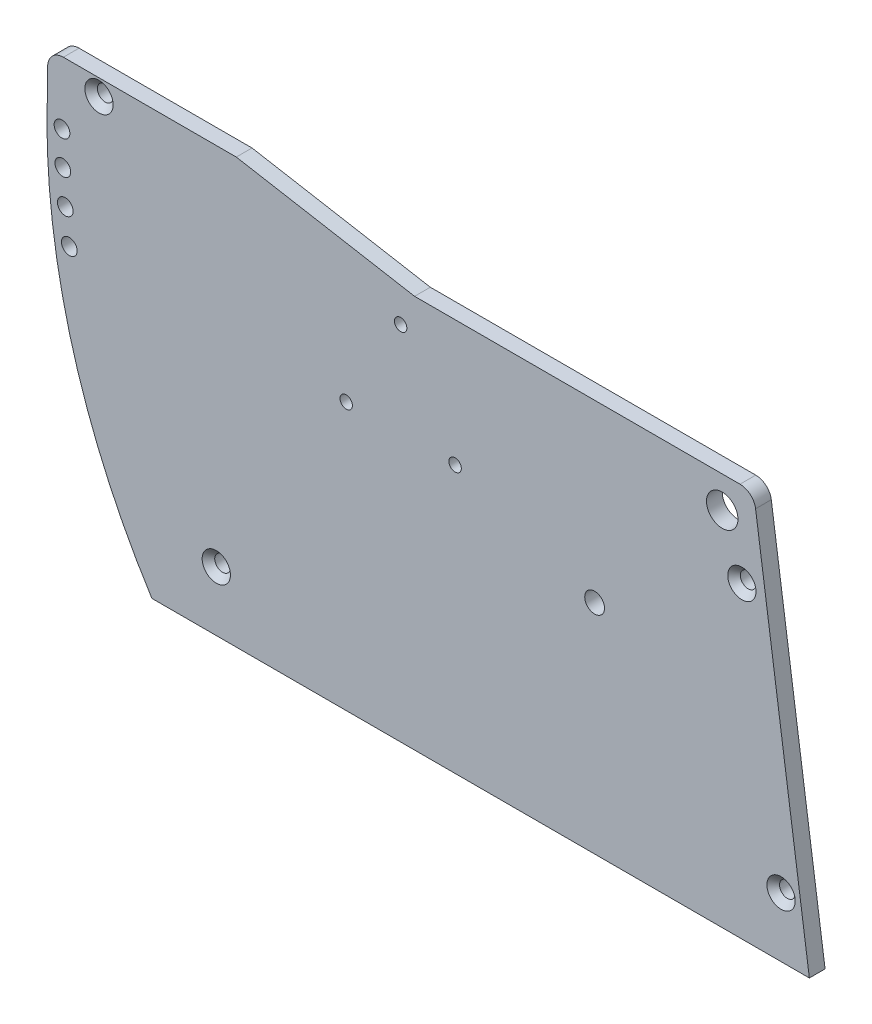
ISO-10303-21;
HEADER;
FILE_DESCRIPTION(('STEP AP214'),'2;1');
FILE_NAME('part.step','',(''),(''),'','','');
FILE_SCHEMA(('AUTOMOTIVE_DESIGN { 1 0 10303 214 1 1 1 1 }'));
ENDSEC;
DATA;
#1=APPLICATION_CONTEXT('core data for automotive mechanical design processes');
#2=APPLICATION_PROTOCOL_DEFINITION('international standard','automotive_design',2000,#1);
#3=PRODUCT_CONTEXT('',#1,'mechanical');
#4=PRODUCT('Part','Part','',(#3));
#5=PRODUCT_RELATED_PRODUCT_CATEGORY('part','',(#4));
#6=PRODUCT_DEFINITION_FORMATION('','',#4);
#7=PRODUCT_DEFINITION_CONTEXT('part definition',#1,'design');
#8=PRODUCT_DEFINITION('design','',#6,#7);
#9=PRODUCT_DEFINITION_SHAPE('','',#8);
#10=(LENGTH_UNIT() NAMED_UNIT(*) SI_UNIT(.MILLI.,.METRE.));
#11=(NAMED_UNIT(*) PLANE_ANGLE_UNIT() SI_UNIT($,.RADIAN.));
#12=(NAMED_UNIT(*) SI_UNIT($,.STERADIAN.) SOLID_ANGLE_UNIT());
#13=UNCERTAINTY_MEASURE_WITH_UNIT(LENGTH_MEASURE(1.E-05),#10,'distance_accuracy_value','');
#14=(GEOMETRIC_REPRESENTATION_CONTEXT(3) GLOBAL_UNCERTAINTY_ASSIGNED_CONTEXT((#13)) GLOBAL_UNIT_ASSIGNED_CONTEXT((#10,
#11,#12)) REPRESENTATION_CONTEXT('',''));
#15=CARTESIAN_POINT('',(0.,0.,0.));
#16=DIRECTION('',(0.,0.,1.));
#17=DIRECTION('',(1.,0.,0.));
#18=AXIS2_PLACEMENT_3D('',#15,#16,#17);
#19=CARTESIAN_POINT('',(-35.2009387661787,146.05,6.35));
#20=DIRECTION('',(0.,0.,1.));
#21=DIRECTION('',(1.,0.,0.));
#22=AXIS2_PLACEMENT_3D('',#19,#20,#21);
#23=PLANE('',#22);
#24=CARTESIAN_POINT('',(-86.7471560291438,87.9531330256865,6.35));
#25=DIRECTION('',(0.,0.,1.));
#26=DIRECTION('',(1.,0.,0.));
#27=AXIS2_PLACEMENT_3D('',#24,#25,#26);
#28=CIRCLE('',#27,3.99999999999999);
#29=CARTESIAN_POINT('',(-90.7471560291438,87.9531330256865,6.34999999999999));
#30=VERTEX_POINT('',#29);
#31=EDGE_CURVE('E378',#30,#30,#28,.T.);
#32=ORIENTED_EDGE('',*,*,#31,.F.);
#33=EDGE_LOOP('',(#32));
#34=FACE_BOUND('',#33,.T.);
#35=CARTESIAN_POINT('',(-286.962142024651,164.850708953326,6.35));
#36=DIRECTION('',(0.,0.,1.));
#37=DIRECTION('',(1.,0.,0.));
#38=AXIS2_PLACEMENT_3D('',#35,#36,#37);
#39=CIRCLE('',#38,5.71499999999997);
#40=CARTESIAN_POINT('',(-281.247142024651,164.850708953326,6.35));
#41=VERTEX_POINT('',#40);
#42=EDGE_CURVE('E186',#41,#41,#39,.F.);
#43=ORIENTED_EDGE('',*,*,#42,.T.);
#44=EDGE_LOOP('',(#43));
#45=FACE_BOUND('',#44,.T.);
#46=CARTESIAN_POINT('',(-239.568937637439,24.0347281379075,6.35));
#47=DIRECTION('',(0.,0.,1.));
#48=DIRECTION('',(1.,0.,0.));
#49=AXIS2_PLACEMENT_3D('',#46,#47,#48);
#50=CIRCLE('',#49,5.71499999999997);
#51=CARTESIAN_POINT('',(-233.853937637439,24.0347281379075,6.35));
#52=VERTEX_POINT('',#51);
#53=EDGE_CURVE('E183',#52,#52,#50,.F.);
#54=ORIENTED_EDGE('',*,*,#53,.T.);
#55=EDGE_LOOP('',(#54));
#56=FACE_BOUND('',#55,.T.);
#57=CARTESIAN_POINT('',(-11.4234736217519,24.0347281379078,6.35));
#58=DIRECTION('',(0.,0.,1.));
#59=DIRECTION('',(1.,0.,0.));
#60=AXIS2_PLACEMENT_3D('',#57,#58,#59);
#61=CIRCLE('',#60,5.71500000000008);
#62=CARTESIAN_POINT('',(-5.70847362175186,24.0347281379078,6.35));
#63=VERTEX_POINT('',#62);
#64=EDGE_CURVE('E180',#63,#63,#61,.F.);
#65=ORIENTED_EDGE('',*,*,#64,.T.);
#66=EDGE_LOOP('',(#65));
#67=FACE_BOUND('',#66,.T.);
#68=CARTESIAN_POINT('',(-27.2533561942031,124.406511892071,6.35));
#69=DIRECTION('',(0.,0.,1.));
#70=DIRECTION('',(1.,0.,0.));
#71=AXIS2_PLACEMENT_3D('',#68,#69,#70);
#72=CIRCLE('',#71,5.71499999999997);
#73=CARTESIAN_POINT('',(-21.5383561942032,124.406511892071,6.35));
#74=VERTEX_POINT('',#73);
#75=EDGE_CURVE('E177',#74,#74,#72,.F.);
#76=ORIENTED_EDGE('',*,*,#75,.T.);
#77=EDGE_LOOP('',(#76));
#78=FACE_BOUND('',#77,.T.);
#79=CARTESIAN_POINT('',(-143.102954743874,107.95,6.35));
#80=DIRECTION('',(0.,0.,1.));
#81=DIRECTION('',(1.,0.,0.));
#82=AXIS2_PLACEMENT_3D('',#79,#80,#81);
#83=CIRCLE('',#82,2.50189999999999);
#84=CARTESIAN_POINT('',(-140.601054743874,107.95,6.35));
#85=VERTEX_POINT('',#84);
#86=EDGE_CURVE('E280',#85,#85,#83,.T.);
#87=ORIENTED_EDGE('',*,*,#86,.F.);
#88=EDGE_LOOP('',(#87));
#89=FACE_BOUND('',#88,.T.);
#90=CARTESIAN_POINT('',(-300.579872802987,119.537524267107,6.35));
#91=DIRECTION('',(0.,0.,1.));
#92=DIRECTION('',(1.,0.,0.));
#93=AXIS2_PLACEMENT_3D('',#90,#91,#92);
#94=CIRCLE('',#93,3.17499999999997);
#95=CARTESIAN_POINT('',(-297.404872802987,119.537524267107,6.35));
#96=VERTEX_POINT('',#95);
#97=EDGE_CURVE('E296',#96,#96,#94,.T.);
#98=ORIENTED_EDGE('',*,*,#97,.F.);
#99=EDGE_LOOP('',(#98));
#100=FACE_BOUND('',#99,.T.);
#101=CARTESIAN_POINT('',(-301.900938766179,146.05,6.35));
#102=DIRECTION('',(0.,0.,1.));
#103=DIRECTION('',(1.,0.,0.));
#104=AXIS2_PLACEMENT_3D('',#101,#102,#103);
#105=CIRCLE('',#104,3.17500000000009);
#106=CARTESIAN_POINT('',(-298.725938766179,146.05,6.35));
#107=VERTEX_POINT('',#106);
#108=EDGE_CURVE('E308',#107,#107,#105,.T.);
#109=ORIENTED_EDGE('',*,*,#108,.F.);
#110=EDGE_LOOP('',(#109));
#111=FACE_BOUND('',#110,.T.);
#112=CARTESIAN_POINT('',(-165.1,146.05,6.35));
#113=DIRECTION('',(0.,0.,1.));
#114=DIRECTION('',(1.,0.,0.));
#115=AXIS2_PLACEMENT_3D('',#112,#113,#114);
#116=CIRCLE('',#115,2.50190000000001);
#117=CARTESIAN_POINT('',(-162.5981,146.05,6.35));
#118=VERTEX_POINT('',#117);
#119=EDGE_CURVE('E143',#118,#118,#116,.T.);
#120=ORIENTED_EDGE('',*,*,#119,.F.);
#121=EDGE_LOOP('',(#120));
#122=FACE_BOUND('',#121,.T.);
#123=CARTESIAN_POINT('',(-35.2009387661787,146.05,6.35));
#124=DIRECTION('',(0.,0.,1.));
#125=DIRECTION('',(1.,0.,0.));
#126=AXIS2_PLACEMENT_3D('',#123,#124,#125);
#127=CIRCLE('',#126,272.793908928316);
#128=CARTESIAN_POINT('',(-307.699061233821,158.75,6.35));
#129=VERTEX_POINT('',#128);
#130=CARTESIAN_POINT('',(-265.60474569738,0.,6.35));
#131=VERTEX_POINT('',#130);
#132=EDGE_CURVE('E156',#129,#131,#127,.T.);
#133=ORIENTED_EDGE('',*,*,#132,.T.);
#134=DIRECTION('',(1.,0.,0.));
#135=VECTOR('',#134,1.);
#136=CARTESIAN_POINT('',(0.,0.,6.35));
#137=LINE('',#136,#135);
#138=CARTESIAN_POINT('',(0.,0.,6.35));
#139=VERTEX_POINT('',#138);
#140=EDGE_CURVE('E99',#131,#139,#137,.T.);
#141=ORIENTED_EDGE('',*,*,#140,.T.);
#142=DIRECTION('',(-0.140335555823671,0.990104000482607,0.));
#143=VECTOR('',#142,1.);
#144=CARTESIAN_POINT('',(0.,0.,6.35));
#145=LINE('',#144,#143);
#146=CARTESIAN_POINT('',(-21.7272084854638,153.29113077948,6.35));
#147=VERTEX_POINT('',#146);
#148=EDGE_CURVE('E332',#139,#147,#145,.T.);
#149=ORIENTED_EDGE('',*,*,#148,.T.);
#150=CARTESIAN_POINT('',(-28.0143688885283,152.4,6.35));
#151=DIRECTION('',(0.,0.,1.));
#152=DIRECTION('',(1.,0.,0.));
#153=AXIS2_PLACEMENT_3D('',#150,#151,#152);
#154=CIRCLE('',#153,6.34999999999999);
#155=CARTESIAN_POINT('',(-28.0143688885287,158.75,6.35));
#156=VERTEX_POINT('',#155);
#157=EDGE_CURVE('E334',#147,#156,#154,.T.);
#158=ORIENTED_EDGE('',*,*,#157,.T.);
#159=DIRECTION('',(-1.,0.,0.));
#160=VECTOR('',#159,1.);
#161=CARTESIAN_POINT('',(-28.0143688885287,158.75,6.35));
#162=LINE('',#161,#160);
#163=CARTESIAN_POINT('',(-159.473782124677,158.75,6.35));
#164=VERTEX_POINT('',#163);
#165=EDGE_CURVE('E336',#156,#164,#162,.T.);
#166=ORIENTED_EDGE('',*,*,#165,.T.);
#167=DIRECTION('',(-0.984807753012208,0.173648177666931,0.));
#168=VECTOR('',#167,1.);
#169=CARTESIAN_POINT('',(-159.473782124677,158.75,6.35));
#170=LINE('',#169,#168);
#171=CARTESIAN_POINT('',(-231.499061233821,171.45,6.35));
#172=VERTEX_POINT('',#171);
#173=EDGE_CURVE('E121',#164,#172,#170,.T.);
#174=ORIENTED_EDGE('',*,*,#173,.T.);
#175=DIRECTION('',(-1.,0.,0.));
#176=VECTOR('',#175,1.);
#177=CARTESIAN_POINT('',(-231.499061233821,171.45,6.35));
#178=LINE('',#177,#176);
#179=CARTESIAN_POINT('',(-301.349061233822,171.45,6.35));
#180=VERTEX_POINT('',#179);
#181=EDGE_CURVE('E115',#172,#180,#178,.T.);
#182=ORIENTED_EDGE('',*,*,#181,.T.);
#183=CARTESIAN_POINT('',(-301.349061233821,165.1,6.35));
#184=DIRECTION('',(0.,0.,1.));
#185=DIRECTION('',(1.,0.,0.));
#186=AXIS2_PLACEMENT_3D('',#183,#184,#185);
#187=CIRCLE('',#186,6.34999999999995);
#188=CARTESIAN_POINT('',(-307.699061233821,165.1,6.35));
#189=VERTEX_POINT('',#188);
#190=EDGE_CURVE('E119',#180,#189,#187,.T.);
#191=ORIENTED_EDGE('',*,*,#190,.T.);
#192=DIRECTION('',(0.,-1.,0.));
#193=VECTOR('',#192,1.);
#194=CARTESIAN_POINT('',(-307.699061233821,165.1,6.35));
#195=LINE('',#194,#193);
#196=EDGE_CURVE('E52',#189,#129,#195,.T.);
#197=ORIENTED_EDGE('',*,*,#196,.T.);
#198=EDGE_LOOP('',(#133,#141,#149,#158,#166,#174,#182,#191,#197));
#199=FACE_BOUND('',#198,.T.);
#200=CARTESIAN_POINT('',(-35.2009387661787,146.05,6.35));
#201=DIRECTION('',(0.,0.,1.));
#202=DIRECTION('',(1.,0.,0.));
#203=AXIS2_PLACEMENT_3D('',#200,#201,#202);
#204=CIRCLE('',#203,6.35000000000001);
#205=CARTESIAN_POINT('',(-28.8509387661787,146.05,6.35));
#206=VERTEX_POINT('',#205);
#207=EDGE_CURVE('E314',#206,#206,#204,.T.);
#208=ORIENTED_EDGE('',*,*,#207,.F.);
#209=EDGE_LOOP('',(#208));
#210=FACE_BOUND('',#209,.T.);
#211=CARTESIAN_POINT('',(-301.569673588463,132.761391751744,6.35));
#212=DIRECTION('',(0.,0.,1.));
#213=DIRECTION('',(1.,0.,0.));
#214=AXIS2_PLACEMENT_3D('',#211,#212,#213);
#215=CIRCLE('',#214,3.17500000000009);
#216=CARTESIAN_POINT('',(-298.394673588463,132.761391751744,6.35));
#217=VERTEX_POINT('',#216);
#218=EDGE_CURVE('E302',#217,#217,#215,.T.);
#219=ORIENTED_EDGE('',*,*,#218,.F.);
#220=EDGE_LOOP('',(#219));
#221=FACE_BOUND('',#220,.T.);
#222=CARTESIAN_POINT('',(-298.943543443745,106.442822899216,6.35));
#223=DIRECTION('',(0.,0.,1.));
#224=DIRECTION('',(1.,0.,0.));
#225=AXIS2_PLACEMENT_3D('',#222,#223,#224);
#226=CIRCLE('',#225,3.17499999999997);
#227=CARTESIAN_POINT('',(-295.768543443745,106.442822899216,6.35));
#228=VERTEX_POINT('',#227);
#229=EDGE_CURVE('E290',#228,#228,#226,.T.);
#230=ORIENTED_EDGE('',*,*,#229,.F.);
#231=EDGE_LOOP('',(#230));
#232=FACE_BOUND('',#231,.T.);
#233=CARTESIAN_POINT('',(-187.097045256124,107.95,6.35));
#234=DIRECTION('',(0.,0.,1.));
#235=DIRECTION('',(1.,0.,0.));
#236=AXIS2_PLACEMENT_3D('',#233,#234,#235);
#237=CIRCLE('',#236,2.50189999999999);
#238=CARTESIAN_POINT('',(-184.595145256124,107.95,6.35));
#239=VERTEX_POINT('',#238);
#240=EDGE_CURVE('E377',#239,#239,#237,.T.);
#241=ORIENTED_EDGE('',*,*,#240,.F.);
#242=EDGE_LOOP('',(#241));
#243=FACE_BOUND('',#242,.T.);
#244=ADVANCED_FACE('F35',(#34,#45,#56,#67,#78,#89,#100,#111,#122,#199,#210,#221,#232,#243),#23,.T.);
#245=CARTESIAN_POINT('',(-35.2009387661787,146.05,0.));
#246=DIRECTION('',(0.,0.,1.));
#247=DIRECTION('',(1.,0.,0.));
#248=AXIS2_PLACEMENT_3D('',#245,#246,#247);
#249=PLANE('',#248);
#250=CARTESIAN_POINT('',(-86.7471560291438,87.9531330256865,0.));
#251=DIRECTION('',(0.,0.,-1.));
#252=DIRECTION('',(-1.,0.,0.));
#253=AXIS2_PLACEMENT_3D('',#250,#251,#252);
#254=CIRCLE('',#253,3.99999999999999);
#255=CARTESIAN_POINT('',(-90.7471560291438,87.9531330256865,0.));
#256=VERTEX_POINT('',#255);
#257=EDGE_CURVE('E383',#256,#256,#254,.T.);
#258=ORIENTED_EDGE('',*,*,#257,.F.);
#259=EDGE_LOOP('',(#258));
#260=FACE_BOUND('',#259,.T.);
#261=CARTESIAN_POINT('',(-35.2009387661787,146.05,0.));
#262=DIRECTION('',(0.,0.,1.));
#263=DIRECTION('',(1.,0.,0.));
#264=AXIS2_PLACEMENT_3D('',#261,#262,#263);
#265=CIRCLE('',#264,272.793908928316);
#266=CARTESIAN_POINT('',(-307.699061233821,158.75,0.));
#267=VERTEX_POINT('',#266);
#268=CARTESIAN_POINT('',(-265.60474569738,0.,0.));
#269=VERTEX_POINT('',#268);
#270=EDGE_CURVE('E139',#267,#269,#265,.T.);
#271=ORIENTED_EDGE('',*,*,#270,.F.);
#272=DIRECTION('',(0.,-1.,0.));
#273=VECTOR('',#272,1.);
#274=CARTESIAN_POINT('',(-307.699061233821,165.1,0.));
#275=LINE('',#274,#273);
#276=CARTESIAN_POINT('',(-307.699061233821,165.1,0.));
#277=VERTEX_POINT('',#276);
#278=EDGE_CURVE('E90',#277,#267,#275,.T.);
#279=ORIENTED_EDGE('',*,*,#278,.F.);
#280=CARTESIAN_POINT('',(-301.349061233821,165.1,0.));
#281=DIRECTION('',(0.,0.,1.));
#282=DIRECTION('',(1.,0.,0.));
#283=AXIS2_PLACEMENT_3D('',#280,#281,#282);
#284=CIRCLE('',#283,6.34999999999995);
#285=CARTESIAN_POINT('',(-301.349061233822,171.45,0.));
#286=VERTEX_POINT('',#285);
#287=EDGE_CURVE('E84',#286,#277,#284,.T.);
#288=ORIENTED_EDGE('',*,*,#287,.F.);
#289=DIRECTION('',(-1.,0.,0.));
#290=VECTOR('',#289,1.);
#291=CARTESIAN_POINT('',(-231.499061233821,171.45,0.));
#292=LINE('',#291,#290);
#293=CARTESIAN_POINT('',(-231.499061233821,171.45,0.));
#294=VERTEX_POINT('',#293);
#295=EDGE_CURVE('E129',#294,#286,#292,.T.);
#296=ORIENTED_EDGE('',*,*,#295,.F.);
#297=DIRECTION('',(-0.984807753012208,0.173648177666931,0.));
#298=VECTOR('',#297,1.);
#299=CARTESIAN_POINT('',(-159.473782124677,158.75,0.));
#300=LINE('',#299,#298);
#301=CARTESIAN_POINT('',(-159.473782124677,158.75,0.));
#302=VERTEX_POINT('',#301);
#303=EDGE_CURVE('E151',#302,#294,#300,.T.);
#304=ORIENTED_EDGE('',*,*,#303,.F.);
#305=DIRECTION('',(-1.,0.,0.));
#306=VECTOR('',#305,1.);
#307=CARTESIAN_POINT('',(-28.0143688885287,158.75,0.));
#308=LINE('',#307,#306);
#309=CARTESIAN_POINT('',(-28.0143688885287,158.75,0.));
#310=VERTEX_POINT('',#309);
#311=EDGE_CURVE('E149',#310,#302,#308,.T.);
#312=ORIENTED_EDGE('',*,*,#311,.F.);
#313=CARTESIAN_POINT('',(-28.0143688885283,152.4,0.));
#314=DIRECTION('',(0.,0.,1.));
#315=DIRECTION('',(1.,0.,0.));
#316=AXIS2_PLACEMENT_3D('',#313,#314,#315);
#317=CIRCLE('',#316,6.34999999999999);
#318=CARTESIAN_POINT('',(-21.7272084854638,153.29113077948,0.));
#319=VERTEX_POINT('',#318);
#320=EDGE_CURVE('E147',#319,#310,#317,.T.);
#321=ORIENTED_EDGE('',*,*,#320,.F.);
#322=DIRECTION('',(-0.140335555823671,0.990104000482607,0.));
#323=VECTOR('',#322,1.);
#324=CARTESIAN_POINT('',(0.,0.,0.));
#325=LINE('',#324,#323);
#326=CARTESIAN_POINT('',(0.,0.,0.));
#327=VERTEX_POINT('',#326);
#328=EDGE_CURVE('E145',#327,#319,#325,.T.);
#329=ORIENTED_EDGE('',*,*,#328,.F.);
#330=DIRECTION('',(1.,0.,0.));
#331=VECTOR('',#330,1.);
#332=CARTESIAN_POINT('',(0.,0.,0.));
#333=LINE('',#332,#331);
#334=EDGE_CURVE('E142',#269,#327,#333,.T.);
#335=ORIENTED_EDGE('',*,*,#334,.F.);
#336=EDGE_LOOP('',(#271,#279,#288,#296,#304,#312,#321,#329,#335));
#337=FACE_BOUND('',#336,.T.);
#338=CARTESIAN_POINT('',(-165.1,146.05,0.));
#339=DIRECTION('',(0.,0.,1.));
#340=DIRECTION('',(1.,0.,0.));
#341=AXIS2_PLACEMENT_3D('',#338,#339,#340);
#342=CIRCLE('',#341,2.50190000000001);
#343=CARTESIAN_POINT('',(-162.5981,146.05,0.));
#344=VERTEX_POINT('',#343);
#345=EDGE_CURVE('E325',#344,#344,#342,.T.);
#346=ORIENTED_EDGE('',*,*,#345,.T.);
#347=EDGE_LOOP('',(#346));
#348=FACE_BOUND('',#347,.T.);
#349=CARTESIAN_POINT('',(-11.4234736217519,24.0347281379078,0.));
#350=DIRECTION('',(0.,0.,1.));
#351=DIRECTION('',(1.,0.,0.));
#352=AXIS2_PLACEMENT_3D('',#349,#350,#351);
#353=CIRCLE('',#352,3.175);
#354=CARTESIAN_POINT('',(-8.24847362175195,24.0347281379078,0.));
#355=VERTEX_POINT('',#354);
#356=EDGE_CURVE('E322',#355,#355,#353,.T.);
#357=ORIENTED_EDGE('',*,*,#356,.T.);
#358=EDGE_LOOP('',(#357));
#359=FACE_BOUND('',#358,.T.);
#360=CARTESIAN_POINT('',(-27.2533561942031,124.406511892071,0.));
#361=DIRECTION('',(0.,0.,1.));
#362=DIRECTION('',(1.,0.,0.));
#363=AXIS2_PLACEMENT_3D('',#360,#361,#362);
#364=CIRCLE('',#363,3.175);
#365=CARTESIAN_POINT('',(-24.0783561942031,124.406511892071,0.));
#366=VERTEX_POINT('',#365);
#367=EDGE_CURVE('E317',#366,#366,#364,.T.);
#368=ORIENTED_EDGE('',*,*,#367,.T.);
#369=EDGE_LOOP('',(#368));
#370=FACE_BOUND('',#369,.T.);
#371=CARTESIAN_POINT('',(-35.2009387661787,146.05,0.));
#372=DIRECTION('',(0.,0.,1.));
#373=DIRECTION('',(1.,0.,0.));
#374=AXIS2_PLACEMENT_3D('',#371,#372,#373);
#375=CIRCLE('',#374,6.35000000000001);
#376=CARTESIAN_POINT('',(-28.8509387661787,146.05,0.));
#377=VERTEX_POINT('',#376);
#378=EDGE_CURVE('E311',#377,#377,#375,.T.);
#379=ORIENTED_EDGE('',*,*,#378,.T.);
#380=EDGE_LOOP('',(#379));
#381=FACE_BOUND('',#380,.T.);
#382=CARTESIAN_POINT('',(-301.900938766179,146.05,0.));
#383=DIRECTION('',(0.,0.,1.));
#384=DIRECTION('',(1.,0.,0.));
#385=AXIS2_PLACEMENT_3D('',#382,#383,#384);
#386=CIRCLE('',#385,3.17500000000009);
#387=CARTESIAN_POINT('',(-298.725938766179,146.05,0.));
#388=VERTEX_POINT('',#387);
#389=EDGE_CURVE('E305',#388,#388,#386,.T.);
#390=ORIENTED_EDGE('',*,*,#389,.T.);
#391=EDGE_LOOP('',(#390));
#392=FACE_BOUND('',#391,.T.);
#393=CARTESIAN_POINT('',(-301.569673588463,132.761391751744,0.));
#394=DIRECTION('',(0.,0.,1.));
#395=DIRECTION('',(1.,0.,0.));
#396=AXIS2_PLACEMENT_3D('',#393,#394,#395);
#397=CIRCLE('',#396,3.17500000000009);
#398=CARTESIAN_POINT('',(-298.394673588463,132.761391751744,0.));
#399=VERTEX_POINT('',#398);
#400=EDGE_CURVE('E299',#399,#399,#397,.T.);
#401=ORIENTED_EDGE('',*,*,#400,.T.);
#402=EDGE_LOOP('',(#401));
#403=FACE_BOUND('',#402,.T.);
#404=CARTESIAN_POINT('',(-300.579872802987,119.537524267107,0.));
#405=DIRECTION('',(0.,0.,1.));
#406=DIRECTION('',(1.,0.,0.));
#407=AXIS2_PLACEMENT_3D('',#404,#405,#406);
#408=CIRCLE('',#407,3.17499999999997);
#409=CARTESIAN_POINT('',(-297.404872802987,119.537524267107,0.));
#410=VERTEX_POINT('',#409);
#411=EDGE_CURVE('E293',#410,#410,#408,.T.);
#412=ORIENTED_EDGE('',*,*,#411,.T.);
#413=EDGE_LOOP('',(#412));
#414=FACE_BOUND('',#413,.T.);
#415=CARTESIAN_POINT('',(-298.943543443745,106.442822899216,0.));
#416=DIRECTION('',(0.,0.,1.));
#417=DIRECTION('',(1.,0.,0.));
#418=AXIS2_PLACEMENT_3D('',#415,#416,#417);
#419=CIRCLE('',#418,3.17499999999997);
#420=CARTESIAN_POINT('',(-295.768543443745,106.442822899216,0.));
#421=VERTEX_POINT('',#420);
#422=EDGE_CURVE('E283',#421,#421,#419,.T.);
#423=ORIENTED_EDGE('',*,*,#422,.T.);
#424=EDGE_LOOP('',(#423));
#425=FACE_BOUND('',#424,.T.);
#426=CARTESIAN_POINT('',(-239.568937637439,24.0347281379075,0.));
#427=DIRECTION('',(0.,0.,1.));
#428=DIRECTION('',(1.,0.,0.));
#429=AXIS2_PLACEMENT_3D('',#426,#427,#428);
#430=CIRCLE('',#429,3.175);
#431=CARTESIAN_POINT('',(-236.393937637439,24.0347281379075,0.));
#432=VERTEX_POINT('',#431);
#433=EDGE_CURVE('E279',#432,#432,#430,.T.);
#434=ORIENTED_EDGE('',*,*,#433,.T.);
#435=EDGE_LOOP('',(#434));
#436=FACE_BOUND('',#435,.T.);
#437=CARTESIAN_POINT('',(-286.962142024651,164.850708953326,0.));
#438=DIRECTION('',(0.,0.,1.));
#439=DIRECTION('',(1.,0.,0.));
#440=AXIS2_PLACEMENT_3D('',#437,#438,#439);
#441=CIRCLE('',#440,3.17499999999997);
#442=CARTESIAN_POINT('',(-283.787142024651,164.850708953326,0.));
#443=VERTEX_POINT('',#442);
#444=EDGE_CURVE('E277',#443,#443,#441,.T.);
#445=ORIENTED_EDGE('',*,*,#444,.T.);
#446=EDGE_LOOP('',(#445));
#447=FACE_BOUND('',#446,.T.);
#448=CARTESIAN_POINT('',(-143.102954743874,107.95,0.));
#449=DIRECTION('',(0.,0.,1.));
#450=DIRECTION('',(1.,0.,0.));
#451=AXIS2_PLACEMENT_3D('',#448,#449,#450);
#452=CIRCLE('',#451,2.50189999999999);
#453=CARTESIAN_POINT('',(-140.601054743874,107.95,0.));
#454=VERTEX_POINT('',#453);
#455=EDGE_CURVE('E286',#454,#454,#452,.T.);
#456=ORIENTED_EDGE('',*,*,#455,.T.);
#457=EDGE_LOOP('',(#456));
#458=FACE_BOUND('',#457,.T.);
#459=CARTESIAN_POINT('',(-187.097045256124,107.95,0.));
#460=DIRECTION('',(0.,0.,1.));
#461=DIRECTION('',(1.,0.,0.));
#462=AXIS2_PLACEMENT_3D('',#459,#460,#461);
#463=CIRCLE('',#462,2.50189999999999);
#464=CARTESIAN_POINT('',(-184.595145256124,107.95,0.));
#465=VERTEX_POINT('',#464);
#466=EDGE_CURVE('E375',#465,#465,#463,.T.);
#467=ORIENTED_EDGE('',*,*,#466,.T.);
#468=EDGE_LOOP('',(#467));
#469=FACE_BOUND('',#468,.T.);
#470=ADVANCED_FACE('F212',(#260,#337,#348,#359,#370,#381,#392,#403,#414,#425,#436,#447,#458,
#469),#249,.F.);
#471=CARTESIAN_POINT('',(-35.2009387661787,146.05,6.35));
#472=DIRECTION('',(0.,0.,-1.));
#473=DIRECTION('',(-1.,0.,0.));
#474=AXIS2_PLACEMENT_3D('',#471,#472,#473);
#475=CYLINDRICAL_SURFACE('',#474,272.793908928316);
#476=ORIENTED_EDGE('',*,*,#270,.T.);
#477=DIRECTION('',(0.,0.,-1.));
#478=VECTOR('',#477,1.);
#479=CARTESIAN_POINT('',(-265.60474569738,0.,6.35));
#480=LINE('',#479,#478);
#481=EDGE_CURVE('E172',#131,#269,#480,.T.);
#482=ORIENTED_EDGE('',*,*,#481,.F.);
#483=ORIENTED_EDGE('',*,*,#132,.F.);
#484=DIRECTION('',(0.,0.,-1.));
#485=VECTOR('',#484,1.);
#486=CARTESIAN_POINT('',(-307.699061233821,158.75,6.35));
#487=LINE('',#486,#485);
#488=EDGE_CURVE('E135',#129,#267,#487,.T.);
#489=ORIENTED_EDGE('',*,*,#488,.T.);
#490=EDGE_LOOP('',(#476,#482,#483,#489));
#491=FACE_BOUND('',#490,.T.);
#492=ADVANCED_FACE('F219',(#491),#475,.T.);
#493=CARTESIAN_POINT('',(0.,0.,6.35));
#494=DIRECTION('',(0.,1.,0.));
#495=DIRECTION('',(-1.,0.,0.));
#496=AXIS2_PLACEMENT_3D('',#493,#494,#495);
#497=PLANE('',#496);
#498=ORIENTED_EDGE('',*,*,#334,.T.);
#499=DIRECTION('',(0.,0.,-1.));
#500=VECTOR('',#499,1.);
#501=CARTESIAN_POINT('',(0.,0.,6.35));
#502=LINE('',#501,#500);
#503=EDGE_CURVE('E169',#139,#327,#502,.T.);
#504=ORIENTED_EDGE('',*,*,#503,.F.);
#505=ORIENTED_EDGE('',*,*,#140,.F.);
#506=ORIENTED_EDGE('',*,*,#481,.T.);
#507=EDGE_LOOP('',(#498,#504,#505,#506));
#508=FACE_BOUND('',#507,.T.);
#509=ADVANCED_FACE('F250',(#508),#497,.F.);
#510=CARTESIAN_POINT('',(0.,0.,6.35));
#511=DIRECTION('',(-0.990104000482606,-0.140335555823671,0.));
#512=DIRECTION('',(0.140335555823671,-0.990104000482607,0.));
#513=AXIS2_PLACEMENT_3D('',#510,#511,#512);
#514=PLANE('',#513);
#515=ORIENTED_EDGE('',*,*,#328,.T.);
#516=DIRECTION('',(0.,0.,-1.));
#517=VECTOR('',#516,1.);
#518=CARTESIAN_POINT('',(-21.7272084854638,153.29113077948,6.35));
#519=LINE('',#518,#517);
#520=EDGE_CURVE('E166',#147,#319,#519,.T.);
#521=ORIENTED_EDGE('',*,*,#520,.F.);
#522=ORIENTED_EDGE('',*,*,#148,.F.);
#523=ORIENTED_EDGE('',*,*,#503,.T.);
#524=EDGE_LOOP('',(#515,#521,#522,#523));
#525=FACE_BOUND('',#524,.T.);
#526=ADVANCED_FACE('F246',(#525),#514,.F.);
#527=CARTESIAN_POINT('',(-28.0143688885283,152.4,6.35));
#528=DIRECTION('',(0.,0.,-1.));
#529=DIRECTION('',(-1.,0.,0.));
#530=AXIS2_PLACEMENT_3D('',#527,#528,#529);
#531=CYLINDRICAL_SURFACE('',#530,6.34999999999999);
#532=ORIENTED_EDGE('',*,*,#320,.T.);
#533=DIRECTION('',(0.,0.,-1.));
#534=VECTOR('',#533,1.);
#535=CARTESIAN_POINT('',(-28.0143688885287,158.75,6.35));
#536=LINE('',#535,#534);
#537=EDGE_CURVE('E163',#156,#310,#536,.T.);
#538=ORIENTED_EDGE('',*,*,#537,.F.);
#539=ORIENTED_EDGE('',*,*,#157,.F.);
#540=ORIENTED_EDGE('',*,*,#520,.T.);
#541=EDGE_LOOP('',(#532,#538,#539,#540));
#542=FACE_BOUND('',#541,.T.);
#543=ADVANCED_FACE('F242',(#542),#531,.T.);
#544=CARTESIAN_POINT('',(-28.0143688885287,158.75,6.35));
#545=DIRECTION('',(0.,-1.,0.));
#546=DIRECTION('',(0.,0.,-1.));
#547=AXIS2_PLACEMENT_3D('',#544,#545,#546);
#548=PLANE('',#547);
#549=ORIENTED_EDGE('',*,*,#311,.T.);
#550=DIRECTION('',(0.,0.,-1.));
#551=VECTOR('',#550,1.);
#552=CARTESIAN_POINT('',(-159.473782124677,158.75,6.35));
#553=LINE('',#552,#551);
#554=EDGE_CURVE('E160',#164,#302,#553,.T.);
#555=ORIENTED_EDGE('',*,*,#554,.F.);
#556=ORIENTED_EDGE('',*,*,#165,.F.);
#557=ORIENTED_EDGE('',*,*,#537,.T.);
#558=EDGE_LOOP('',(#549,#555,#556,#557));
#559=FACE_BOUND('',#558,.T.);
#560=ADVANCED_FACE('F238',(#559),#548,.F.);
#561=CARTESIAN_POINT('',(-159.473782124677,158.75,6.35));
#562=DIRECTION('',(-0.173648177666931,-0.984807753012208,0.));
#563=DIRECTION('',(0.984807753012208,-0.173648177666931,0.));
#564=AXIS2_PLACEMENT_3D('',#561,#562,#563);
#565=PLANE('',#564);
#566=ORIENTED_EDGE('',*,*,#303,.T.);
#567=DIRECTION('',(0.,0.,-1.));
#568=VECTOR('',#567,1.);
#569=CARTESIAN_POINT('',(-231.499061233821,171.45,6.35));
#570=LINE('',#569,#568);
#571=EDGE_CURVE('E130',#172,#294,#570,.T.);
#572=ORIENTED_EDGE('',*,*,#571,.F.);
#573=ORIENTED_EDGE('',*,*,#173,.F.);
#574=ORIENTED_EDGE('',*,*,#554,.T.);
#575=EDGE_LOOP('',(#566,#572,#573,#574));
#576=FACE_BOUND('',#575,.T.);
#577=ADVANCED_FACE('F235',(#576),#565,.F.);
#578=CARTESIAN_POINT('',(-231.499061233821,171.45,6.35));
#579=DIRECTION('',(0.,-1.,0.));
#580=DIRECTION('',(1.,0.,0.));
#581=AXIS2_PLACEMENT_3D('',#578,#579,#580);
#582=PLANE('',#581);
#583=ORIENTED_EDGE('',*,*,#295,.T.);
#584=DIRECTION('',(0.,0.,-1.));
#585=VECTOR('',#584,1.);
#586=CARTESIAN_POINT('',(-301.349061233822,171.45,6.35));
#587=LINE('',#586,#585);
#588=EDGE_CURVE('E126',#180,#286,#587,.T.);
#589=ORIENTED_EDGE('',*,*,#588,.F.);
#590=ORIENTED_EDGE('',*,*,#181,.F.);
#591=ORIENTED_EDGE('',*,*,#571,.T.);
#592=EDGE_LOOP('',(#583,#589,#590,#591));
#593=FACE_BOUND('',#592,.T.);
#594=ADVANCED_FACE('F127',(#593),#582,.F.);
#595=CARTESIAN_POINT('',(-301.349061233821,165.1,6.35));
#596=DIRECTION('',(0.,0.,-1.));
#597=DIRECTION('',(-1.,0.,0.));
#598=AXIS2_PLACEMENT_3D('',#595,#596,#597);
#599=CYLINDRICAL_SURFACE('',#598,6.34999999999995);
#600=ORIENTED_EDGE('',*,*,#287,.T.);
#601=DIRECTION('',(0.,0.,-1.));
#602=VECTOR('',#601,1.);
#603=CARTESIAN_POINT('',(-307.699061233821,165.1,6.35));
#604=LINE('',#603,#602);
#605=EDGE_CURVE('E131',#189,#277,#604,.T.);
#606=ORIENTED_EDGE('',*,*,#605,.F.);
#607=ORIENTED_EDGE('',*,*,#190,.F.);
#608=ORIENTED_EDGE('',*,*,#588,.T.);
#609=EDGE_LOOP('',(#600,#606,#607,#608));
#610=FACE_BOUND('',#609,.T.);
#611=ADVANCED_FACE('F133',(#610),#599,.T.);
#612=CARTESIAN_POINT('',(-307.699061233821,165.1,6.35));
#613=DIRECTION('',(1.,0.,0.));
#614=DIRECTION('',(0.,0.,-1.));
#615=AXIS2_PLACEMENT_3D('',#612,#613,#614);
#616=PLANE('',#615);
#617=ORIENTED_EDGE('',*,*,#278,.T.);
#618=ORIENTED_EDGE('',*,*,#488,.F.);
#619=ORIENTED_EDGE('',*,*,#196,.F.);
#620=ORIENTED_EDGE('',*,*,#605,.T.);
#621=EDGE_LOOP('',(#617,#618,#619,#620));
#622=FACE_BOUND('',#621,.T.);
#623=ADVANCED_FACE('F228',(#622),#616,.F.);
#624=CARTESIAN_POINT('',(-165.1,146.05,6.35));
#625=DIRECTION('',(0.,0.,-1.));
#626=DIRECTION('',(-1.,0.,0.));
#627=AXIS2_PLACEMENT_3D('',#624,#625,#626);
#628=CYLINDRICAL_SURFACE('',#627,2.50190000000001);
#629=ORIENTED_EDGE('',*,*,#119,.T.);
#630=EDGE_LOOP('',(#629));
#631=FACE_BOUND('',#630,.T.);
#632=ORIENTED_EDGE('',*,*,#345,.F.);
#633=EDGE_LOOP('',(#632));
#634=FACE_BOUND('',#633,.T.);
#635=ADVANCED_FACE('F225',(#631,#634),#628,.F.);
#636=CARTESIAN_POINT('',(-11.4234736217519,24.0347281379078,6.35));
#637=DIRECTION('',(0.,0.,-1.));
#638=DIRECTION('',(-1.,0.,0.));
#639=AXIS2_PLACEMENT_3D('',#636,#637,#638);
#640=CYLINDRICAL_SURFACE('',#639,3.175);
#641=CARTESIAN_POINT('',(-11.4234736217519,24.0347281379078,3.80999999999993));
#642=DIRECTION('',(0.,0.,1.));
#643=DIRECTION('',(1.,0.,0.));
#644=AXIS2_PLACEMENT_3D('',#641,#642,#643);
#645=CIRCLE('',#644,3.175);
#646=CARTESIAN_POINT('',(-8.24847362175195,24.0347281379078,3.80999999999993));
#647=VERTEX_POINT('',#646);
#648=EDGE_CURVE('E44',#647,#647,#645,.T.);
#649=ORIENTED_EDGE('',*,*,#648,.T.);
#650=EDGE_LOOP('',(#649));
#651=FACE_BOUND('',#650,.T.);
#652=ORIENTED_EDGE('',*,*,#356,.F.);
#653=EDGE_LOOP('',(#652));
#654=FACE_BOUND('',#653,.T.);
#655=ADVANCED_FACE('F194',(#651,#654),#640,.F.);
#656=CARTESIAN_POINT('',(-27.2533561942031,124.406511892071,6.35));
#657=DIRECTION('',(0.,0.,-1.));
#658=DIRECTION('',(-1.,0.,0.));
#659=AXIS2_PLACEMENT_3D('',#656,#657,#658);
#660=CYLINDRICAL_SURFACE('',#659,3.175);
#661=CARTESIAN_POINT('',(-27.2533561942031,124.406511892071,3.81000000000005));
#662=DIRECTION('',(0.,0.,1.));
#663=DIRECTION('',(1.,0.,0.));
#664=AXIS2_PLACEMENT_3D('',#661,#662,#663);
#665=CIRCLE('',#664,3.175);
#666=CARTESIAN_POINT('',(-24.0783561942031,124.406511892071,3.81000000000005));
#667=VERTEX_POINT('',#666);
#668=EDGE_CURVE('E11',#667,#667,#665,.T.);
#669=ORIENTED_EDGE('',*,*,#668,.T.);
#670=EDGE_LOOP('',(#669));
#671=FACE_BOUND('',#670,.T.);
#672=ORIENTED_EDGE('',*,*,#367,.F.);
#673=EDGE_LOOP('',(#672));
#674=FACE_BOUND('',#673,.T.);
#675=ADVANCED_FACE('F420',(#671,#674),#660,.F.);
#676=CARTESIAN_POINT('',(-35.2009387661787,146.05,6.35));
#677=DIRECTION('',(0.,0.,-1.));
#678=DIRECTION('',(-1.,0.,0.));
#679=AXIS2_PLACEMENT_3D('',#676,#677,#678);
#680=CYLINDRICAL_SURFACE('',#679,6.35000000000001);
#681=ORIENTED_EDGE('',*,*,#207,.T.);
#682=EDGE_LOOP('',(#681));
#683=FACE_BOUND('',#682,.T.);
#684=ORIENTED_EDGE('',*,*,#378,.F.);
#685=EDGE_LOOP('',(#684));
#686=FACE_BOUND('',#685,.T.);
#687=ADVANCED_FACE('F416',(#683,#686),#680,.F.);
#688=CARTESIAN_POINT('',(-301.900938766179,146.05,6.35));
#689=DIRECTION('',(0.,0.,-1.));
#690=DIRECTION('',(-1.,0.,0.));
#691=AXIS2_PLACEMENT_3D('',#688,#689,#690);
#692=CYLINDRICAL_SURFACE('',#691,3.17500000000009);
#693=ORIENTED_EDGE('',*,*,#108,.T.);
#694=EDGE_LOOP('',(#693));
#695=FACE_BOUND('',#694,.T.);
#696=ORIENTED_EDGE('',*,*,#389,.F.);
#697=EDGE_LOOP('',(#696));
#698=FACE_BOUND('',#697,.T.);
#699=ADVANCED_FACE('F412',(#695,#698),#692,.F.);
#700=CARTESIAN_POINT('',(-301.569673588463,132.761391751744,6.35));
#701=DIRECTION('',(0.,0.,-1.));
#702=DIRECTION('',(-1.,0.,0.));
#703=AXIS2_PLACEMENT_3D('',#700,#701,#702);
#704=CYLINDRICAL_SURFACE('',#703,3.17500000000009);
#705=ORIENTED_EDGE('',*,*,#218,.T.);
#706=EDGE_LOOP('',(#705));
#707=FACE_BOUND('',#706,.T.);
#708=ORIENTED_EDGE('',*,*,#400,.F.);
#709=EDGE_LOOP('',(#708));
#710=FACE_BOUND('',#709,.T.);
#711=ADVANCED_FACE('F408',(#707,#710),#704,.F.);
#712=CARTESIAN_POINT('',(-300.579872802987,119.537524267107,6.35));
#713=DIRECTION('',(0.,0.,-1.));
#714=DIRECTION('',(-1.,0.,0.));
#715=AXIS2_PLACEMENT_3D('',#712,#713,#714);
#716=CYLINDRICAL_SURFACE('',#715,3.17499999999997);
#717=ORIENTED_EDGE('',*,*,#97,.T.);
#718=EDGE_LOOP('',(#717));
#719=FACE_BOUND('',#718,.T.);
#720=ORIENTED_EDGE('',*,*,#411,.F.);
#721=EDGE_LOOP('',(#720));
#722=FACE_BOUND('',#721,.T.);
#723=ADVANCED_FACE('F404',(#719,#722),#716,.F.);
#724=CARTESIAN_POINT('',(-298.943543443745,106.442822899216,6.35));
#725=DIRECTION('',(0.,0.,-1.));
#726=DIRECTION('',(-1.,0.,0.));
#727=AXIS2_PLACEMENT_3D('',#724,#725,#726);
#728=CYLINDRICAL_SURFACE('',#727,3.17499999999997);
#729=ORIENTED_EDGE('',*,*,#229,.T.);
#730=EDGE_LOOP('',(#729));
#731=FACE_BOUND('',#730,.T.);
#732=ORIENTED_EDGE('',*,*,#422,.F.);
#733=EDGE_LOOP('',(#732));
#734=FACE_BOUND('',#733,.T.);
#735=ADVANCED_FACE('F400',(#731,#734),#728,.F.);
#736=CARTESIAN_POINT('',(-239.568937637439,24.0347281379075,6.35));
#737=DIRECTION('',(0.,0.,-1.));
#738=DIRECTION('',(-1.,0.,0.));
#739=AXIS2_PLACEMENT_3D('',#736,#737,#738);
#740=CYLINDRICAL_SURFACE('',#739,3.175);
#741=CARTESIAN_POINT('',(-239.568937637439,24.0347281379075,3.81000000000004));
#742=DIRECTION('',(0.,0.,1.));
#743=DIRECTION('',(1.,0.,0.));
#744=AXIS2_PLACEMENT_3D('',#741,#742,#743);
#745=CIRCLE('',#744,3.175);
#746=CARTESIAN_POINT('',(-236.393937637439,24.0347281379075,3.81000000000004));
#747=VERTEX_POINT('',#746);
#748=EDGE_CURVE('E189',#747,#747,#745,.T.);
#749=ORIENTED_EDGE('',*,*,#748,.T.);
#750=EDGE_LOOP('',(#749));
#751=FACE_BOUND('',#750,.T.);
#752=ORIENTED_EDGE('',*,*,#433,.F.);
#753=EDGE_LOOP('',(#752));
#754=FACE_BOUND('',#753,.T.);
#755=ADVANCED_FACE('F273',(#751,#754),#740,.F.);
#756=CARTESIAN_POINT('',(-286.962142024651,164.850708953326,6.35));
#757=DIRECTION('',(0.,0.,-1.));
#758=DIRECTION('',(-1.,0.,0.));
#759=AXIS2_PLACEMENT_3D('',#756,#757,#758);
#760=CYLINDRICAL_SURFACE('',#759,3.17499999999997);
#761=CARTESIAN_POINT('',(-286.962142024651,164.850708953326,3.81000000000002));
#762=DIRECTION('',(0.,0.,1.));
#763=DIRECTION('',(1.,0.,0.));
#764=AXIS2_PLACEMENT_3D('',#761,#762,#763);
#765=CIRCLE('',#764,3.17499999999997);
#766=CARTESIAN_POINT('',(-283.787142024651,164.850708953326,3.81000000000002));
#767=VERTEX_POINT('',#766);
#768=EDGE_CURVE('E174',#767,#767,#765,.T.);
#769=ORIENTED_EDGE('',*,*,#768,.T.);
#770=EDGE_LOOP('',(#769));
#771=FACE_BOUND('',#770,.T.);
#772=ORIENTED_EDGE('',*,*,#444,.F.);
#773=EDGE_LOOP('',(#772));
#774=FACE_BOUND('',#773,.T.);
#775=ADVANCED_FACE('F270',(#771,#774),#760,.F.);
#776=CARTESIAN_POINT('',(-143.102954743874,107.95,6.35));
#777=DIRECTION('',(0.,0.,-1.));
#778=DIRECTION('',(-1.,0.,0.));
#779=AXIS2_PLACEMENT_3D('',#776,#777,#778);
#780=CYLINDRICAL_SURFACE('',#779,2.50189999999999);
#781=ORIENTED_EDGE('',*,*,#86,.T.);
#782=EDGE_LOOP('',(#781));
#783=FACE_BOUND('',#782,.T.);
#784=ORIENTED_EDGE('',*,*,#455,.F.);
#785=EDGE_LOOP('',(#784));
#786=FACE_BOUND('',#785,.T.);
#787=ADVANCED_FACE('F263',(#783,#786),#780,.F.);
#788=CARTESIAN_POINT('',(-187.097045256124,107.95,6.35));
#789=DIRECTION('',(0.,0.,-1.));
#790=DIRECTION('',(-1.,0.,0.));
#791=AXIS2_PLACEMENT_3D('',#788,#789,#790);
#792=CYLINDRICAL_SURFACE('',#791,2.50189999999999);
#793=ORIENTED_EDGE('',*,*,#240,.T.);
#794=EDGE_LOOP('',(#793));
#795=FACE_BOUND('',#794,.T.);
#796=ORIENTED_EDGE('',*,*,#466,.F.);
#797=EDGE_LOOP('',(#796));
#798=FACE_BOUND('',#797,.T.);
#799=ADVANCED_FACE('F258',(#795,#798),#792,.F.);
#800=CARTESIAN_POINT('',(-286.962142024651,164.850708953326,3.81000000000002));
#801=DIRECTION('',(0.,0.,1.));
#802=DIRECTION('',(1.,0.,0.));
#803=AXIS2_PLACEMENT_3D('',#800,#801,#802);
#804=CONICAL_SURFACE('',#803,3.17499999999997,0.785398163397452);
#805=ORIENTED_EDGE('',*,*,#42,.F.);
#806=EDGE_LOOP('',(#805));
#807=FACE_BOUND('',#806,.T.);
#808=ORIENTED_EDGE('',*,*,#768,.F.);
#809=EDGE_LOOP('',(#808));
#810=FACE_BOUND('',#809,.T.);
#811=ADVANCED_FACE('F207',(#807,#810),#804,.F.);
#812=CARTESIAN_POINT('',(-239.568937637439,24.0347281379075,3.81000000000004));
#813=DIRECTION('',(0.,0.,1.));
#814=DIRECTION('',(1.,0.,0.));
#815=AXIS2_PLACEMENT_3D('',#812,#813,#814);
#816=CONICAL_SURFACE('',#815,3.175,0.785398163397451);
#817=ORIENTED_EDGE('',*,*,#53,.F.);
#818=EDGE_LOOP('',(#817));
#819=FACE_BOUND('',#818,.T.);
#820=ORIENTED_EDGE('',*,*,#748,.F.);
#821=EDGE_LOOP('',(#820));
#822=FACE_BOUND('',#821,.T.);
#823=ADVANCED_FACE('F199',(#819,#822),#816,.F.);
#824=CARTESIAN_POINT('',(-11.4234736217519,24.0347281379078,3.80999999999993));
#825=DIRECTION('',(0.,0.,1.));
#826=DIRECTION('',(1.,0.,0.));
#827=AXIS2_PLACEMENT_3D('',#824,#825,#826);
#828=CONICAL_SURFACE('',#827,3.175,0.785398163397451);
#829=ORIENTED_EDGE('',*,*,#64,.F.);
#830=EDGE_LOOP('',(#829));
#831=FACE_BOUND('',#830,.T.);
#832=ORIENTED_EDGE('',*,*,#648,.F.);
#833=EDGE_LOOP('',(#832));
#834=FACE_BOUND('',#833,.T.);
#835=ADVANCED_FACE('F197',(#831,#834),#828,.F.);
#836=CARTESIAN_POINT('',(-27.2533561942031,124.406511892071,3.81000000000005));
#837=DIRECTION('',(0.,0.,1.));
#838=DIRECTION('',(1.,0.,0.));
#839=AXIS2_PLACEMENT_3D('',#836,#837,#838);
#840=CONICAL_SURFACE('',#839,3.175,0.785398163397452);
#841=ORIENTED_EDGE('',*,*,#75,.F.);
#842=EDGE_LOOP('',(#841));
#843=FACE_BOUND('',#842,.T.);
#844=ORIENTED_EDGE('',*,*,#668,.F.);
#845=EDGE_LOOP('',(#844));
#846=FACE_BOUND('',#845,.T.);
#847=ADVANCED_FACE('F37',(#843,#846),#840,.F.);
#848=CARTESIAN_POINT('',(-86.7471560291438,87.9531330256865,43.434));
#849=DIRECTION('',(0.,0.,-1.));
#850=DIRECTION('',(-1.,0.,0.));
#851=AXIS2_PLACEMENT_3D('',#848,#849,#850);
#852=CYLINDRICAL_SURFACE('',#851,3.99999999999999);
#853=CARTESIAN_POINT('',(-90.7471560291438,87.9531330256865,6.34999999999999));
#854=CARTESIAN_POINT('',(-90.7471560291438,87.9531330256865,6.28385416666666));
#855=CARTESIAN_POINT('',(-90.7471560291438,87.9531330256865,6.21770833333333));
#856=CARTESIAN_POINT('',(-90.7471560291438,87.9531330256865,6.08541666666666));
#857=CARTESIAN_POINT('',(-90.7471560291438,87.9531330256865,6.01927083333333));
#858=CARTESIAN_POINT('',(-90.7471560291438,87.9531330256865,5.88697916666666));
#859=CARTESIAN_POINT('',(-90.7471560291438,87.9531330256865,5.82083333333333));
#860=CARTESIAN_POINT('',(-90.7471560291438,87.9531330256865,5.68854166666666));
#861=CARTESIAN_POINT('',(-90.7471560291438,87.9531330256865,5.62239583333333));
#862=CARTESIAN_POINT('',(-90.7471560291438,87.9531330256865,5.49010416666667));
#863=CARTESIAN_POINT('',(-90.7471560291438,87.9531330256865,5.42395833333333));
#864=CARTESIAN_POINT('',(-90.7471560291438,87.9531330256865,5.29166666666666));
#865=CARTESIAN_POINT('',(-90.7471560291438,87.9531330256865,5.22552083333333));
#866=CARTESIAN_POINT('',(-90.7471560291438,87.9531330256865,5.09322916666666));
#867=CARTESIAN_POINT('',(-90.7471560291438,87.9531330256865,5.02708333333333));
#868=CARTESIAN_POINT('',(-90.7471560291438,87.9531330256865,4.89479166666666));
#869=CARTESIAN_POINT('',(-90.7471560291438,87.9531330256865,4.82864583333333));
#870=CARTESIAN_POINT('',(-90.7471560291438,87.9531330256865,4.69635416666666));
#871=CARTESIAN_POINT('',(-90.7471560291438,87.9531330256865,4.63020833333333));
#872=CARTESIAN_POINT('',(-90.7471560291438,87.9531330256865,4.49791666666666));
#873=CARTESIAN_POINT('',(-90.7471560291438,87.9531330256865,4.43177083333333));
#874=CARTESIAN_POINT('',(-90.7471560291438,87.9531330256865,4.29947916666666));
#875=CARTESIAN_POINT('',(-90.7471560291438,87.9531330256865,4.23333333333333));
#876=CARTESIAN_POINT('',(-90.7471560291438,87.9531330256865,4.10104166666666));
#877=CARTESIAN_POINT('',(-90.7471560291438,87.9531330256865,4.03489583333333));
#878=CARTESIAN_POINT('',(-90.7471560291438,87.9531330256865,3.90260416666666));
#879=CARTESIAN_POINT('',(-90.7471560291438,87.9531330256865,3.83645833333333));
#880=CARTESIAN_POINT('',(-90.7471560291438,87.9531330256865,3.70416666666666));
#881=CARTESIAN_POINT('',(-90.7471560291438,87.9531330256865,3.63802083333333));
#882=CARTESIAN_POINT('',(-90.7471560291438,87.9531330256865,3.50572916666666));
#883=CARTESIAN_POINT('',(-90.7471560291438,87.9531330256865,3.43958333333333));
#884=CARTESIAN_POINT('',(-90.7471560291438,87.9531330256865,3.30729166666667));
#885=CARTESIAN_POINT('',(-90.7471560291438,87.9531330256865,3.24114583333333));
#886=CARTESIAN_POINT('',(-90.7471560291438,87.9531330256865,3.10885416666666));
#887=CARTESIAN_POINT('',(-90.7471560291438,87.9531330256865,3.04270833333333));
#888=CARTESIAN_POINT('',(-90.7471560291438,87.9531330256865,2.91041666666666));
#889=CARTESIAN_POINT('',(-90.7471560291438,87.9531330256865,2.84427083333333));
#890=CARTESIAN_POINT('',(-90.7471560291438,87.9531330256865,2.71197916666667));
#891=CARTESIAN_POINT('',(-90.7471560291438,87.9531330256865,2.64583333333333));
#892=CARTESIAN_POINT('',(-90.7471560291438,87.9531330256865,2.51354166666667));
#893=CARTESIAN_POINT('',(-90.7471560291438,87.9531330256865,2.44739583333333));
#894=CARTESIAN_POINT('',(-90.7471560291438,87.9531330256865,2.31510416666667));
#895=CARTESIAN_POINT('',(-90.7471560291438,87.9531330256865,2.24895833333333));
#896=CARTESIAN_POINT('',(-90.7471560291438,87.9531330256865,2.11666666666666));
#897=CARTESIAN_POINT('',(-90.7471560291438,87.9531330256865,2.05052083333333));
#898=CARTESIAN_POINT('',(-90.7471560291438,87.9531330256865,1.91822916666666));
#899=CARTESIAN_POINT('',(-90.7471560291438,87.9531330256865,1.85208333333333));
#900=CARTESIAN_POINT('',(-90.7471560291438,87.9531330256865,1.71979166666667));
#901=CARTESIAN_POINT('',(-90.7471560291438,87.9531330256865,1.65364583333333));
#902=CARTESIAN_POINT('',(-90.7471560291438,87.9531330256865,1.52135416666666));
#903=CARTESIAN_POINT('',(-90.7471560291438,87.9531330256865,1.45520833333333));
#904=CARTESIAN_POINT('',(-90.7471560291438,87.9531330256865,1.32291666666666));
#905=CARTESIAN_POINT('',(-90.7471560291438,87.9531330256865,1.25677083333333));
#906=CARTESIAN_POINT('',(-90.7471560291438,87.9531330256865,1.12447916666667));
#907=CARTESIAN_POINT('',(-90.7471560291438,87.9531330256865,1.05833333333333));
#908=CARTESIAN_POINT('',(-90.7471560291438,87.9531330256865,0.926041666666664));
#909=CARTESIAN_POINT('',(-90.7471560291438,87.9531330256865,0.85989583333333));
#910=CARTESIAN_POINT('',(-90.7471560291438,87.9531330256865,0.727604166666664));
#911=CARTESIAN_POINT('',(-90.7471560291438,87.9531330256865,0.661458333333332));
#912=CARTESIAN_POINT('',(-90.7471560291438,87.9531330256865,0.529166666666666));
#913=CARTESIAN_POINT('',(-90.7471560291438,87.9531330256865,0.463020833333332));
#914=CARTESIAN_POINT('',(-90.7471560291438,87.9531330256865,0.330729166666666));
#915=CARTESIAN_POINT('',(-90.7471560291438,87.9531330256865,0.264583333333334));
#916=CARTESIAN_POINT('',(-90.7471560291438,87.9531330256865,0.132291666666668));
#917=CARTESIAN_POINT('',(-90.7471560291438,87.9531330256865,0.0661458333333342));
#918=CARTESIAN_POINT('',(-90.7471560291438,87.9531330256865,0.));
#919=B_SPLINE_CURVE_WITH_KNOTS('',3,(#853,#854,#855,#856,#857,#858,#859,#860,#861,#862,#863,
#864,#865,#866,#867,#868,#869,#870,#871,#872,#873,#874,#875,#876,#877,#878,#879,#880,#881,#882,
#883,#884,#885,#886,#887,#888,#889,#890,#891,#892,#893,#894,#895,#896,#897,#898,#899,#900,#901,
#902,#903,#904,#905,#906,#907,#908,#909,#910,#911,#912,#913,#914,#915,#916,#917,#918),
.UNSPECIFIED.,.F.,.F.,(4,2,2,2,2,2,2,2,2,2,2,2,2,2,2,2,2,2,2,2,2,2,2,2,2,2,2,2,2,2,2,2,4),(0.,
0.198437500000002,0.396874999999998,0.5953125,0.793749999999996,0.992187499999998,1.190625,
1.3890625,1.5875,1.7859375,1.984375,2.1828125,2.38125,2.5796875,2.778125,2.97656249999999,3.175,
3.3734375,3.571875,3.7703125,3.96874999999999,4.1671875,4.365625,4.56406249999999,4.7625,
4.9609375,5.15937499999999,5.3578125,5.55625,5.75468749999999,5.953125,6.15156249999999,
6.34999999999999),.UNSPECIFIED.);
#920=EDGE_CURVE('BSEAM205',#30,#256,#919,.T.);
#921=ORIENTED_EDGE('',*,*,#31,.T.);
#922=ORIENTED_EDGE('',*,*,#257,.T.);
#923=ORIENTED_EDGE('',*,*,#920,.T.);
#924=ORIENTED_EDGE('',*,*,#920,.F.);
#925=EDGE_LOOP('',(#921,#923,#922,#924));
#926=FACE_BOUND('',#925,.T.);
#927=ADVANCED_FACE('F205',(#926),#852,.F.);
#928=CLOSED_SHELL('',(#244,#470,#492,#509,#526,#543,#560,#577,#594,#611,#623,#635,#655,#675,
#687,#699,#711,#723,#735,#755,#775,#787,#799,#811,#823,#835,#847,#927));
#929=MANIFOLD_SOLID_BREP('B2',#928);
#930=ADVANCED_BREP_SHAPE_REPRESENTATION('',(#18,#929),#14);
#931=SHAPE_DEFINITION_REPRESENTATION(#9,#930);
ENDSEC;
END-ISO-10303-21;
